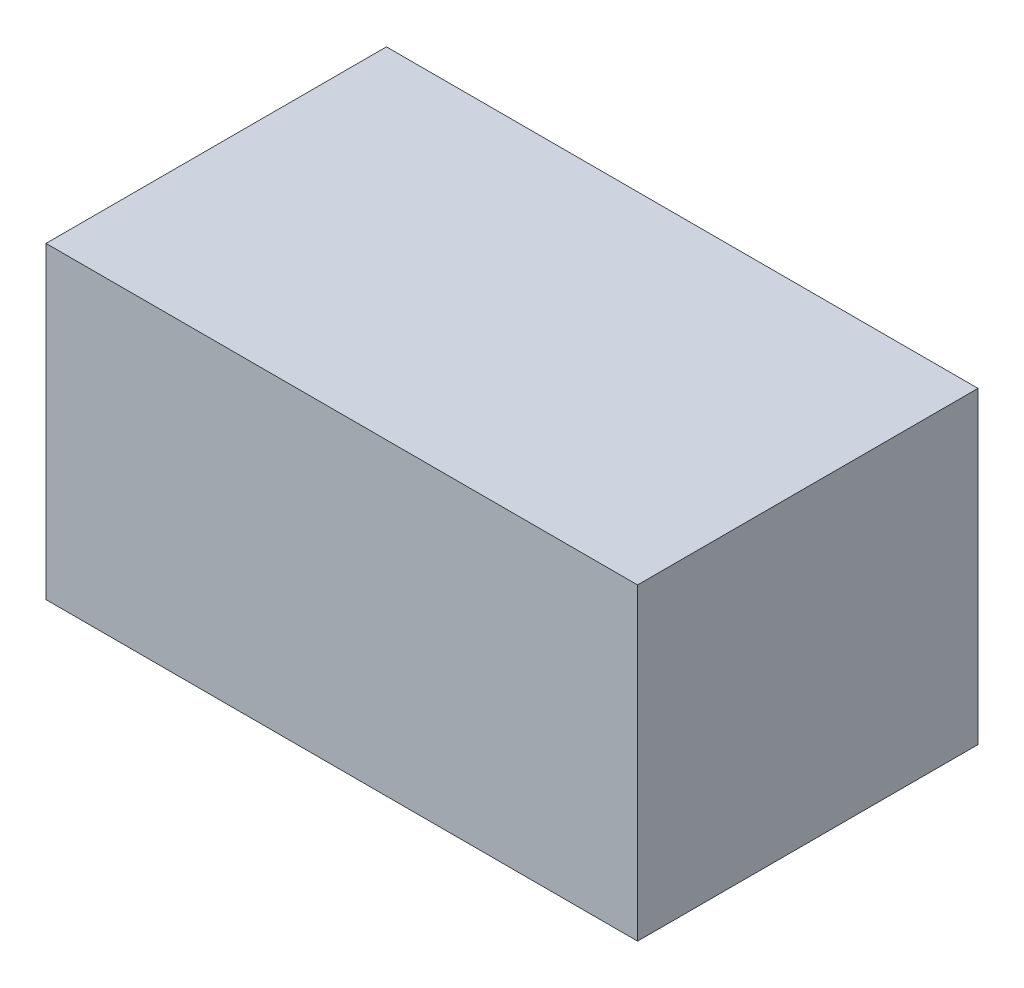
ISO-10303-21;
HEADER;
FILE_DESCRIPTION(('STEP AP214'),'2;1');
FILE_NAME('part.step','',(''),(''),'','','');
FILE_SCHEMA(('AUTOMOTIVE_DESIGN { 1 0 10303 214 1 1 1 1 }'));
ENDSEC;
DATA;
#1=APPLICATION_CONTEXT('core data for automotive mechanical design processes');
#2=APPLICATION_PROTOCOL_DEFINITION('international standard','automotive_design',2000,#1);
#3=PRODUCT_CONTEXT('',#1,'mechanical');
#4=PRODUCT('Part','Part','',(#3));
#5=PRODUCT_RELATED_PRODUCT_CATEGORY('part','',(#4));
#6=PRODUCT_DEFINITION_FORMATION('','',#4);
#7=PRODUCT_DEFINITION_CONTEXT('part definition',#1,'design');
#8=PRODUCT_DEFINITION('design','',#6,#7);
#9=PRODUCT_DEFINITION_SHAPE('','',#8);
#10=(LENGTH_UNIT() NAMED_UNIT(*) SI_UNIT(.MILLI.,.METRE.));
#11=(NAMED_UNIT(*) PLANE_ANGLE_UNIT() SI_UNIT($,.RADIAN.));
#12=(NAMED_UNIT(*) SI_UNIT($,.STERADIAN.) SOLID_ANGLE_UNIT());
#13=UNCERTAINTY_MEASURE_WITH_UNIT(LENGTH_MEASURE(1.E-05),#10,'distance_accuracy_value','');
#14=(GEOMETRIC_REPRESENTATION_CONTEXT(3) GLOBAL_UNCERTAINTY_ASSIGNED_CONTEXT((#13)) GLOBAL_UNIT_ASSIGNED_CONTEXT((#10,
#11,#12)) REPRESENTATION_CONTEXT('',''));
#15=CARTESIAN_POINT('',(0.,0.,0.));
#16=DIRECTION('',(0.,0.,1.));
#17=DIRECTION('',(1.,0.,0.));
#18=AXIS2_PLACEMENT_3D('',#15,#16,#17);
#19=CARTESIAN_POINT('',(-7.72074786236967,8.69243886750483,17.));
#20=DIRECTION('',(1.,0.,0.));
#21=DIRECTION('',(0.,0.,-1.));
#22=AXIS2_PLACEMENT_3D('',#19,#20,#21);
#23=PLANE('',#22);
#24=DIRECTION('',(0.,-1.,0.));
#25=VECTOR('',#24,1.);
#26=CARTESIAN_POINT('',(-7.72074786236967,8.69243886750483,0.));
#27=LINE('',#26,#25);
#28=CARTESIAN_POINT('',(-7.72074786236967,8.69243886750483,0.));
#29=VERTEX_POINT('',#28);
#30=CARTESIAN_POINT('',(-7.72074786236967,-6.71328558530294,0.));
#31=VERTEX_POINT('',#30);
#32=EDGE_CURVE('E282',#29,#31,#27,.T.);
#33=ORIENTED_EDGE('',*,*,#32,.T.);
#34=DIRECTION('',(0.,0.,-1.));
#35=VECTOR('',#34,1.);
#36=CARTESIAN_POINT('',(-7.72074786236967,-6.71328558530294,17.));
#37=LINE('',#36,#35);
#38=CARTESIAN_POINT('',(-7.72074786236967,-6.71328558530294,17.));
#39=VERTEX_POINT('',#38);
#40=EDGE_CURVE('E320',#39,#31,#37,.T.);
#41=ORIENTED_EDGE('',*,*,#40,.F.);
#42=DIRECTION('',(0.,-1.,0.));
#43=VECTOR('',#42,1.);
#44=CARTESIAN_POINT('',(-7.72074786236967,8.69243886750483,17.));
#45=LINE('',#44,#43);
#46=CARTESIAN_POINT('',(-7.72074786236967,8.69243886750483,17.));
#47=VERTEX_POINT('',#46);
#48=EDGE_CURVE('E283',#47,#39,#45,.T.);
#49=ORIENTED_EDGE('',*,*,#48,.F.);
#50=DIRECTION('',(0.,0.,-1.));
#51=VECTOR('',#50,1.);
#52=CARTESIAN_POINT('',(-7.72074786236967,8.69243886750483,17.));
#53=LINE('',#52,#51);
#54=EDGE_CURVE('E297',#47,#29,#53,.T.);
#55=ORIENTED_EDGE('',*,*,#54,.T.);
#56=EDGE_LOOP('',(#33,#41,#49,#55));
#57=FACE_BOUND('',#56,.T.);
#58=ADVANCED_FACE('F51',(#57),#23,.F.);
#59=CARTESIAN_POINT('',(-7.72074786236967,-6.71328558530294,17.));
#60=DIRECTION('',(0.,1.,0.));
#61=DIRECTION('',(0.,0.,1.));
#62=AXIS2_PLACEMENT_3D('',#59,#60,#61);
#63=PLANE('',#62);
#64=DIRECTION('',(1.,0.,0.));
#65=VECTOR('',#64,1.);
#66=CARTESIAN_POINT('',(-7.72074786236967,-6.71328558530294,0.));
#67=LINE('',#66,#65);
#68=CARTESIAN_POINT('',(21.8190512575608,-6.71328558530294,0.));
#69=VERTEX_POINT('',#68);
#70=EDGE_CURVE('E301',#31,#69,#67,.T.);
#71=ORIENTED_EDGE('',*,*,#70,.T.);
#72=DIRECTION('',(0.,0.,-1.));
#73=VECTOR('',#72,1.);
#74=CARTESIAN_POINT('',(21.8190512575608,-6.71328558530294,17.));
#75=LINE('',#74,#73);
#76=CARTESIAN_POINT('',(21.8190512575608,-6.71328558530294,17.));
#77=VERTEX_POINT('',#76);
#78=EDGE_CURVE('E316',#77,#69,#75,.T.);
#79=ORIENTED_EDGE('',*,*,#78,.F.);
#80=DIRECTION('',(1.,0.,0.));
#81=VECTOR('',#80,1.);
#82=CARTESIAN_POINT('',(-7.72074786236967,-6.71328558530294,17.));
#83=LINE('',#82,#81);
#84=EDGE_CURVE('E287',#39,#77,#83,.T.);
#85=ORIENTED_EDGE('',*,*,#84,.F.);
#86=ORIENTED_EDGE('',*,*,#40,.T.);
#87=EDGE_LOOP('',(#71,#79,#85,#86));
#88=FACE_BOUND('',#87,.T.);
#89=ADVANCED_FACE('F390',(#88),#63,.F.);
#90=CARTESIAN_POINT('',(21.8190512575608,8.69243886750483,17.));
#91=DIRECTION('',(-1.,0.,0.));
#92=DIRECTION('',(0.,0.,1.));
#93=AXIS2_PLACEMENT_3D('',#90,#91,#92);
#94=PLANE('',#93);
#95=DIRECTION('',(0.,1.,0.));
#96=VECTOR('',#95,1.);
#97=CARTESIAN_POINT('',(21.8190512575608,8.69243886750483,0.));
#98=LINE('',#97,#96);
#99=CARTESIAN_POINT('',(21.8190512575608,8.69243886750483,0.));
#100=VERTEX_POINT('',#99);
#101=EDGE_CURVE('E304',#69,#100,#98,.T.);
#102=ORIENTED_EDGE('',*,*,#101,.T.);
#103=DIRECTION('',(0.,0.,-1.));
#104=VECTOR('',#103,1.);
#105=CARTESIAN_POINT('',(21.8190512575608,8.69243886750483,17.));
#106=LINE('',#105,#104);
#107=CARTESIAN_POINT('',(21.8190512575608,8.69243886750483,17.));
#108=VERTEX_POINT('',#107);
#109=EDGE_CURVE('E312',#108,#100,#106,.T.);
#110=ORIENTED_EDGE('',*,*,#109,.F.);
#111=DIRECTION('',(0.,1.,0.));
#112=VECTOR('',#111,1.);
#113=CARTESIAN_POINT('',(21.8190512575608,8.69243886750483,17.));
#114=LINE('',#113,#112);
#115=EDGE_CURVE('E291',#77,#108,#114,.T.);
#116=ORIENTED_EDGE('',*,*,#115,.F.);
#117=ORIENTED_EDGE('',*,*,#78,.T.);
#118=EDGE_LOOP('',(#102,#110,#116,#117));
#119=FACE_BOUND('',#118,.T.);
#120=ADVANCED_FACE('F395',(#119),#94,.F.);
#121=CARTESIAN_POINT('',(-7.72074786236967,8.69243886750483,17.));
#122=DIRECTION('',(0.,-1.,0.));
#123=DIRECTION('',(0.,0.,-1.));
#124=AXIS2_PLACEMENT_3D('',#121,#122,#123);
#125=PLANE('',#124);
#126=DIRECTION('',(-1.,0.,0.));
#127=VECTOR('',#126,1.);
#128=CARTESIAN_POINT('',(-7.72074786236967,8.69243886750483,0.));
#129=LINE('',#128,#127);
#130=EDGE_CURVE('E288',#100,#29,#129,.T.);
#131=ORIENTED_EDGE('',*,*,#130,.T.);
#132=ORIENTED_EDGE('',*,*,#54,.F.);
#133=DIRECTION('',(-1.,0.,0.));
#134=VECTOR('',#133,1.);
#135=CARTESIAN_POINT('',(-7.72074786236967,8.69243886750483,17.));
#136=LINE('',#135,#134);
#137=EDGE_CURVE('E294',#108,#47,#136,.T.);
#138=ORIENTED_EDGE('',*,*,#137,.F.);
#139=ORIENTED_EDGE('',*,*,#109,.T.);
#140=EDGE_LOOP('',(#131,#132,#138,#139));
#141=FACE_BOUND('',#140,.T.);
#142=ADVANCED_FACE('F410',(#141),#125,.F.);
#143=CARTESIAN_POINT('',(0.,0.,17.));
#144=DIRECTION('',(0.,0.,1.));
#145=DIRECTION('',(1.,0.,0.));
#146=AXIS2_PLACEMENT_3D('',#143,#144,#145);
#147=PLANE('',#146);
#148=ORIENTED_EDGE('',*,*,#48,.T.);
#149=ORIENTED_EDGE('',*,*,#84,.T.);
#150=ORIENTED_EDGE('',*,*,#115,.T.);
#151=ORIENTED_EDGE('',*,*,#137,.T.);
#152=EDGE_LOOP('',(#148,#149,#150,#151));
#153=FACE_BOUND('',#152,.T.);
#154=ADVANCED_FACE('F406',(#153),#147,.T.);
#155=CARTESIAN_POINT('',(0.,0.,0.));
#156=DIRECTION('',(0.,0.,1.));
#157=DIRECTION('',(1.,0.,0.));
#158=AXIS2_PLACEMENT_3D('',#155,#156,#157);
#159=PLANE('',#158);
#160=DIRECTION('',(-1.,0.,0.));
#161=VECTOR('',#160,1.);
#162=CARTESIAN_POINT('',(20.3190512575608,-1.1528581139363,0.));
#163=LINE('',#162,#161);
#164=CARTESIAN_POINT('',(20.3190512575608,-1.1528581139363,0.));
#165=VERTEX_POINT('',#164);
#166=CARTESIAN_POINT('',(19.3190512575608,-1.1528581139363,0.));
#167=VERTEX_POINT('',#166);
#168=EDGE_CURVE('E206',#165,#167,#163,.T.);
#169=ORIENTED_EDGE('',*,*,#168,.F.);
#170=DIRECTION('',(0.,-1.,0.));
#171=VECTOR('',#170,1.);
#172=CARTESIAN_POINT('',(20.3190512575608,2.3471418860637,0.));
#173=LINE('',#172,#171);
#174=CARTESIAN_POINT('',(20.3190512575608,2.3471418860637,0.));
#175=VERTEX_POINT('',#174);
#176=EDGE_CURVE('E66',#175,#165,#173,.T.);
#177=ORIENTED_EDGE('',*,*,#176,.F.);
#178=DIRECTION('',(1.,0.,0.));
#179=VECTOR('',#178,1.);
#180=CARTESIAN_POINT('',(20.3190512575608,2.3471418860637,0.));
#181=LINE('',#180,#179);
#182=CARTESIAN_POINT('',(19.3190512575608,2.3471418860637,0.));
#183=VERTEX_POINT('',#182);
#184=EDGE_CURVE('E193',#183,#175,#181,.T.);
#185=ORIENTED_EDGE('',*,*,#184,.F.);
#186=DIRECTION('',(0.,1.,0.));
#187=VECTOR('',#186,1.);
#188=CARTESIAN_POINT('',(19.3190512575608,2.3471418860637,0.));
#189=LINE('',#188,#187);
#190=EDGE_CURVE('E197',#167,#183,#189,.T.);
#191=ORIENTED_EDGE('',*,*,#190,.F.);
#192=EDGE_LOOP('',(#169,#177,#185,#191));
#193=FACE_BOUND('',#192,.T.);
#194=DIRECTION('',(-1.,0.,0.));
#195=VECTOR('',#194,1.);
#196=CARTESIAN_POINT('',(-5.22074786236966,-1.1528581139363,0.));
#197=LINE('',#196,#195);
#198=CARTESIAN_POINT('',(-5.22074786236966,-1.1528581139363,0.));
#199=VERTEX_POINT('',#198);
#200=CARTESIAN_POINT('',(-6.22074786236967,-1.1528581139363,0.));
#201=VERTEX_POINT('',#200);
#202=EDGE_CURVE('E243',#199,#201,#197,.T.);
#203=ORIENTED_EDGE('',*,*,#202,.F.);
#204=DIRECTION('',(0.,-1.,0.));
#205=VECTOR('',#204,1.);
#206=CARTESIAN_POINT('',(-5.22074786236966,2.3471418860637,0.));
#207=LINE('',#206,#205);
#208=CARTESIAN_POINT('',(-5.22074786236966,2.3471418860637,0.));
#209=VERTEX_POINT('',#208);
#210=EDGE_CURVE('E74',#209,#199,#207,.T.);
#211=ORIENTED_EDGE('',*,*,#210,.F.);
#212=DIRECTION('',(1.,0.,0.));
#213=VECTOR('',#212,1.);
#214=CARTESIAN_POINT('',(-5.22074786236966,2.3471418860637,0.));
#215=LINE('',#214,#213);
#216=CARTESIAN_POINT('',(-6.22074786236967,2.3471418860637,0.));
#217=VERTEX_POINT('',#216);
#218=EDGE_CURVE('E234',#217,#209,#215,.T.);
#219=ORIENTED_EDGE('',*,*,#218,.F.);
#220=DIRECTION('',(0.,1.,0.));
#221=VECTOR('',#220,1.);
#222=CARTESIAN_POINT('',(-6.22074786236967,2.3471418860637,0.));
#223=LINE('',#222,#221);
#224=EDGE_CURVE('E238',#201,#217,#223,.T.);
#225=ORIENTED_EDGE('',*,*,#224,.F.);
#226=EDGE_LOOP('',(#203,#211,#219,#225));
#227=FACE_BOUND('',#226,.T.);
#228=DIRECTION('',(0.,-1.,0.));
#229=VECTOR('',#228,1.);
#230=CARTESIAN_POINT('',(20.4425185421705,8.,0.));
#231=LINE('',#230,#229);
#232=CARTESIAN_POINT('',(20.4425185421705,8.,0.));
#233=VERTEX_POINT('',#232);
#234=CARTESIAN_POINT('',(20.4425185421705,6.,0.));
#235=VERTEX_POINT('',#234);
#236=EDGE_CURVE('E351',#233,#235,#231,.T.);
#237=ORIENTED_EDGE('',*,*,#236,.F.);
#238=DIRECTION('',(-1.,0.,0.));
#239=VECTOR('',#238,1.);
#240=CARTESIAN_POINT('',(0.,8.,0.));
#241=LINE('',#240,#239);
#242=CARTESIAN_POINT('',(-6.38590858257565,8.,0.));
#243=VERTEX_POINT('',#242);
#244=EDGE_CURVE('E11',#233,#243,#241,.T.);
#245=ORIENTED_EDGE('',*,*,#244,.T.);
#246=DIRECTION('',(0.,-1.,0.));
#247=VECTOR('',#246,1.);
#248=CARTESIAN_POINT('',(-6.38590858257565,8.,0.));
#249=LINE('',#248,#247);
#250=CARTESIAN_POINT('',(-6.38590858257565,6.,0.));
#251=VERTEX_POINT('',#250);
#252=EDGE_CURVE('E59',#251,#243,#249,.F.);
#253=ORIENTED_EDGE('',*,*,#252,.F.);
#254=DIRECTION('',(0.707106781186551,-0.707106781186544,0.));
#255=VECTOR('',#254,1.);
#256=CARTESIAN_POINT('',(7.02830497979745,-7.41421356237296,0.));
#257=LINE('',#256,#255);
#258=CARTESIAN_POINT('',(-0.385908582575589,0.,0.));
#259=VERTEX_POINT('',#258);
#260=EDGE_CURVE('E343',#251,#259,#257,.T.);
#261=ORIENTED_EDGE('',*,*,#260,.T.);
#262=DIRECTION('',(-0.819152044288995,-0.573576436351042,0.));
#263=VECTOR('',#262,1.);
#264=CARTESIAN_POINT('',(7.02830497979745,5.19148822627021,0.));
#265=LINE('',#264,#263);
#266=CARTESIAN_POINT('',(-6.09850060954411,-4.,0.));
#267=VERTEX_POINT('',#266);
#268=EDGE_CURVE('E339',#259,#267,#265,.T.);
#269=ORIENTED_EDGE('',*,*,#268,.T.);
#270=DIRECTION('',(0.,1.,0.));
#271=VECTOR('',#270,1.);
#272=CARTESIAN_POINT('',(-6.09850060954411,-6.,0.));
#273=LINE('',#272,#271);
#274=CARTESIAN_POINT('',(-6.09850060954411,-6.,0.));
#275=VERTEX_POINT('',#274);
#276=EDGE_CURVE('E328',#275,#267,#273,.T.);
#277=ORIENTED_EDGE('',*,*,#276,.F.);
#278=DIRECTION('',(1.,0.,0.));
#279=VECTOR('',#278,1.);
#280=CARTESIAN_POINT('',(0.,-6.,0.));
#281=LINE('',#280,#279);
#282=CARTESIAN_POINT('',(20.155110569139,-6.,0.));
#283=VERTEX_POINT('',#282);
#284=EDGE_CURVE('E324',#275,#283,#281,.T.);
#285=ORIENTED_EDGE('',*,*,#284,.T.);
#286=DIRECTION('',(0.,1.,0.));
#287=VECTOR('',#286,1.);
#288=CARTESIAN_POINT('',(20.155110569139,-6.,0.));
#289=LINE('',#288,#287);
#290=CARTESIAN_POINT('',(20.155110569139,-4.,0.));
#291=VERTEX_POINT('',#290);
#292=EDGE_CURVE('E331',#291,#283,#289,.F.);
#293=ORIENTED_EDGE('',*,*,#292,.F.);
#294=DIRECTION('',(-0.819152044288995,0.573576436351042,0.));
#295=VECTOR('',#294,1.);
#296=CARTESIAN_POINT('',(7.02830497979745,5.19148822627021,0.));
#297=LINE('',#296,#295);
#298=CARTESIAN_POINT('',(14.4425185421705,0.,0.));
#299=VERTEX_POINT('',#298);
#300=EDGE_CURVE('E335',#291,#299,#297,.T.);
#301=ORIENTED_EDGE('',*,*,#300,.T.);
#302=DIRECTION('',(0.707106781186551,0.707106781186544,0.));
#303=VECTOR('',#302,1.);
#304=CARTESIAN_POINT('',(7.02830497979745,-7.41421356237296,0.));
#305=LINE('',#304,#303);
#306=EDGE_CURVE('E347',#299,#235,#305,.T.);
#307=ORIENTED_EDGE('',*,*,#306,.T.);
#308=EDGE_LOOP('',(#237,#245,#253,#261,#269,#277,#285,#293,#301,#307));
#309=FACE_BOUND('',#308,.T.);
#310=ORIENTED_EDGE('',*,*,#32,.F.);
#311=ORIENTED_EDGE('',*,*,#130,.F.);
#312=ORIENTED_EDGE('',*,*,#101,.F.);
#313=ORIENTED_EDGE('',*,*,#70,.F.);
#314=EDGE_LOOP('',(#310,#311,#312,#313));
#315=FACE_BOUND('',#314,.T.);
#316=ADVANCED_FACE('F363',(#193,#227,#309,#315),#159,.F.);
#317=CARTESIAN_POINT('',(7.02830497979745,0.,0.));
#318=DIRECTION('',(0.,-1.,0.));
#319=DIRECTION('',(1.,0.,0.));
#320=AXIS2_PLACEMENT_3D('',#317,#318,#319);
#321=CONICAL_SURFACE('',#320,7.41421356237304,0.959931088596887);
#322=CARTESIAN_POINT('',(7.02830497979745,0.,0.));
#323=DIRECTION('',(0.,1.,0.));
#324=DIRECTION('',(-1.,0.,0.));
#325=AXIS2_PLACEMENT_3D('',#322,#323,#324);
#326=CIRCLE('',#325,7.41421356237304);
#327=EDGE_CURVE('E278',#259,#299,#326,.T.);
#328=ORIENTED_EDGE('',*,*,#327,.T.);
#329=ORIENTED_EDGE('',*,*,#300,.F.);
#330=CARTESIAN_POINT('',(7.02830497979745,-4.,0.));
#331=DIRECTION('',(0.,-1.,0.));
#332=DIRECTION('',(1.,0.,0.));
#333=AXIS2_PLACEMENT_3D('',#330,#331,#332);
#334=CIRCLE('',#333,13.1268055893416);
#335=EDGE_CURVE('E215',#291,#267,#334,.T.);
#336=ORIENTED_EDGE('',*,*,#335,.T.);
#337=ORIENTED_EDGE('',*,*,#268,.F.);
#338=EDGE_LOOP('',(#328,#329,#336,#337));
#339=FACE_BOUND('',#338,.T.);
#340=ADVANCED_FACE('F370',(#339),#321,.F.);
#341=CARTESIAN_POINT('',(7.02830497979745,6.,0.));
#342=DIRECTION('',(0.,1.,0.));
#343=DIRECTION('',(-1.,0.,0.));
#344=AXIS2_PLACEMENT_3D('',#341,#342,#343);
#345=CONICAL_SURFACE('',#344,13.4142135623731,0.785398163397453);
#346=ORIENTED_EDGE('',*,*,#327,.F.);
#347=ORIENTED_EDGE('',*,*,#260,.F.);
#348=CARTESIAN_POINT('',(7.02830497979745,6.,0.));
#349=DIRECTION('',(0.,1.,0.));
#350=DIRECTION('',(-1.,0.,0.));
#351=AXIS2_PLACEMENT_3D('',#348,#349,#350);
#352=CIRCLE('',#351,13.4142135623731);
#353=EDGE_CURVE('E274',#251,#235,#352,.T.);
#354=ORIENTED_EDGE('',*,*,#353,.T.);
#355=ORIENTED_EDGE('',*,*,#306,.F.);
#356=EDGE_LOOP('',(#346,#347,#354,#355));
#357=FACE_BOUND('',#356,.T.);
#358=ADVANCED_FACE('F367',(#357),#345,.F.);
#359=CARTESIAN_POINT('',(7.02830497979745,8.,0.));
#360=DIRECTION('',(0.,-1.,0.));
#361=DIRECTION('',(1.,0.,0.));
#362=AXIS2_PLACEMENT_3D('',#359,#360,#361);
#363=CYLINDRICAL_SURFACE('',#362,13.4142135623731);
#364=ORIENTED_EDGE('',*,*,#252,.T.);
#365=CARTESIAN_POINT('',(7.02830497979745,8.,0.));
#366=DIRECTION('',(0.,1.,0.));
#367=DIRECTION('',(-1.,0.,0.));
#368=AXIS2_PLACEMENT_3D('',#365,#366,#367);
#369=CIRCLE('',#368,13.4142135623731);
#370=EDGE_CURVE('E267',#243,#233,#369,.T.);
#371=ORIENTED_EDGE('',*,*,#370,.T.);
#372=ORIENTED_EDGE('',*,*,#236,.T.);
#373=ORIENTED_EDGE('',*,*,#353,.F.);
#374=EDGE_LOOP('',(#364,#371,#372,#373));
#375=FACE_BOUND('',#374,.T.);
#376=ADVANCED_FACE('F358',(#375),#363,.F.);
#377=CARTESIAN_POINT('',(7.02830497979745,8.,0.));
#378=DIRECTION('',(0.,1.,0.));
#379=DIRECTION('',(-1.,0.,0.));
#380=AXIS2_PLACEMENT_3D('',#377,#378,#379);
#381=PLANE('',#380);
#382=ORIENTED_EDGE('',*,*,#370,.F.);
#383=ORIENTED_EDGE('',*,*,#244,.F.);
#384=EDGE_LOOP('',(#382,#383));
#385=FACE_BOUND('',#384,.T.);
#386=ADVANCED_FACE('F362',(#385),#381,.F.);
#387=CARTESIAN_POINT('',(7.02830497979745,-6.,0.));
#388=DIRECTION('',(0.,1.,0.));
#389=DIRECTION('',(-1.,0.,0.));
#390=AXIS2_PLACEMENT_3D('',#387,#388,#389);
#391=CYLINDRICAL_SURFACE('',#390,13.1268055893416);
#392=ORIENTED_EDGE('',*,*,#292,.T.);
#393=CARTESIAN_POINT('',(7.02830497979745,-6.,0.));
#394=DIRECTION('',(0.,-1.,0.));
#395=DIRECTION('',(1.,0.,0.));
#396=AXIS2_PLACEMENT_3D('',#393,#394,#395);
#397=CIRCLE('',#396,13.1268055893416);
#398=EDGE_CURVE('E263',#283,#275,#397,.T.);
#399=ORIENTED_EDGE('',*,*,#398,.T.);
#400=ORIENTED_EDGE('',*,*,#276,.T.);
#401=ORIENTED_EDGE('',*,*,#335,.F.);
#402=EDGE_LOOP('',(#392,#399,#400,#401));
#403=FACE_BOUND('',#402,.T.);
#404=ADVANCED_FACE('F374',(#403),#391,.F.);
#405=CARTESIAN_POINT('',(7.02830497979745,-6.,0.));
#406=DIRECTION('',(0.,-1.,0.));
#407=DIRECTION('',(1.,0.,0.));
#408=AXIS2_PLACEMENT_3D('',#405,#406,#407);
#409=PLANE('',#408);
#410=ORIENTED_EDGE('',*,*,#398,.F.);
#411=ORIENTED_EDGE('',*,*,#284,.F.);
#412=EDGE_LOOP('',(#410,#411));
#413=FACE_BOUND('',#412,.T.);
#414=ADVANCED_FACE('F376',(#413),#409,.F.);
#415=CARTESIAN_POINT('',(-5.22074786236966,2.3471418860637,2.));
#416=DIRECTION('',(1.,0.,0.));
#417=DIRECTION('',(0.,0.,-1.));
#418=AXIS2_PLACEMENT_3D('',#415,#416,#417);
#419=PLANE('',#418);
#420=ORIENTED_EDGE('',*,*,#210,.T.);
#421=DIRECTION('',(0.,0.,-1.));
#422=VECTOR('',#421,1.);
#423=CARTESIAN_POINT('',(-5.22074786236966,-1.1528581139363,2.));
#424=LINE('',#423,#422);
#425=CARTESIAN_POINT('',(-5.22074786236966,-1.1528581139363,2.));
#426=VERTEX_POINT('',#425);
#427=EDGE_CURVE('E221',#426,#199,#424,.T.);
#428=ORIENTED_EDGE('',*,*,#427,.F.);
#429=DIRECTION('',(0.,-1.,0.));
#430=VECTOR('',#429,1.);
#431=CARTESIAN_POINT('',(-5.22074786236966,2.3471418860637,2.));
#432=LINE('',#431,#430);
#433=CARTESIAN_POINT('',(-5.22074786236966,2.3471418860637,2.));
#434=VERTEX_POINT('',#433);
#435=EDGE_CURVE('E239',#434,#426,#432,.T.);
#436=ORIENTED_EDGE('',*,*,#435,.F.);
#437=DIRECTION('',(0.,0.,-1.));
#438=VECTOR('',#437,1.);
#439=CARTESIAN_POINT('',(-5.22074786236966,2.3471418860637,2.));
#440=LINE('',#439,#438);
#441=EDGE_CURVE('E231',#434,#209,#440,.T.);
#442=ORIENTED_EDGE('',*,*,#441,.T.);
#443=EDGE_LOOP('',(#420,#428,#436,#442));
#444=FACE_BOUND('',#443,.T.);
#445=ADVANCED_FACE('F378',(#444),#419,.F.);
#446=CARTESIAN_POINT('',(-5.22074786236966,2.3471418860637,2.));
#447=DIRECTION('',(0.,1.,0.));
#448=DIRECTION('',(-1.,0.,0.));
#449=AXIS2_PLACEMENT_3D('',#446,#447,#448);
#450=PLANE('',#449);
#451=ORIENTED_EDGE('',*,*,#218,.T.);
#452=ORIENTED_EDGE('',*,*,#441,.F.);
#453=DIRECTION('',(1.,0.,0.));
#454=VECTOR('',#453,1.);
#455=CARTESIAN_POINT('',(-5.22074786236966,2.3471418860637,2.));
#456=LINE('',#455,#454);
#457=CARTESIAN_POINT('',(-6.22074786236967,2.3471418860637,2.));
#458=VERTEX_POINT('',#457);
#459=EDGE_CURVE('E224',#458,#434,#456,.T.);
#460=ORIENTED_EDGE('',*,*,#459,.F.);
#461=DIRECTION('',(0.,0.,-1.));
#462=VECTOR('',#461,1.);
#463=CARTESIAN_POINT('',(-6.22074786236967,2.3471418860637,2.));
#464=LINE('',#463,#462);
#465=EDGE_CURVE('E228',#458,#217,#464,.T.);
#466=ORIENTED_EDGE('',*,*,#465,.T.);
#467=EDGE_LOOP('',(#451,#452,#460,#466));
#468=FACE_BOUND('',#467,.T.);
#469=ADVANCED_FACE('F385',(#468),#450,.F.);
#470=CARTESIAN_POINT('',(-6.22074786236967,2.3471418860637,2.));
#471=DIRECTION('',(-1.,0.,0.));
#472=DIRECTION('',(0.,-1.,0.));
#473=AXIS2_PLACEMENT_3D('',#470,#471,#472);
#474=PLANE('',#473);
#475=ORIENTED_EDGE('',*,*,#224,.T.);
#476=ORIENTED_EDGE('',*,*,#465,.F.);
#477=DIRECTION('',(0.,1.,0.));
#478=VECTOR('',#477,1.);
#479=CARTESIAN_POINT('',(-6.22074786236967,2.3471418860637,2.));
#480=LINE('',#479,#478);
#481=CARTESIAN_POINT('',(-6.22074786236967,-1.1528581139363,2.));
#482=VERTEX_POINT('',#481);
#483=EDGE_CURVE('E252',#482,#458,#480,.T.);
#484=ORIENTED_EDGE('',*,*,#483,.F.);
#485=DIRECTION('',(0.,0.,-1.));
#486=VECTOR('',#485,1.);
#487=CARTESIAN_POINT('',(-6.22074786236967,-1.1528581139363,2.));
#488=LINE('',#487,#486);
#489=EDGE_CURVE('E225',#482,#201,#488,.T.);
#490=ORIENTED_EDGE('',*,*,#489,.T.);
#491=EDGE_LOOP('',(#475,#476,#484,#490));
#492=FACE_BOUND('',#491,.T.);
#493=ADVANCED_FACE('F460',(#492),#474,.F.);
#494=CARTESIAN_POINT('',(-5.22074786236966,-1.1528581139363,2.));
#495=DIRECTION('',(0.,-1.,0.));
#496=DIRECTION('',(0.,0.,-1.));
#497=AXIS2_PLACEMENT_3D('',#494,#495,#496);
#498=PLANE('',#497);
#499=ORIENTED_EDGE('',*,*,#202,.T.);
#500=ORIENTED_EDGE('',*,*,#489,.F.);
#501=DIRECTION('',(-1.,0.,0.));
#502=VECTOR('',#501,1.);
#503=CARTESIAN_POINT('',(-5.22074786236966,-1.1528581139363,2.));
#504=LINE('',#503,#502);
#505=EDGE_CURVE('E256',#426,#482,#504,.T.);
#506=ORIENTED_EDGE('',*,*,#505,.F.);
#507=ORIENTED_EDGE('',*,*,#427,.T.);
#508=EDGE_LOOP('',(#499,#500,#506,#507));
#509=FACE_BOUND('',#508,.T.);
#510=ADVANCED_FACE('F470',(#509),#498,.F.);
#511=CARTESIAN_POINT('',(0.,0.,2.));
#512=DIRECTION('',(0.,0.,-1.));
#513=DIRECTION('',(-1.,0.,0.));
#514=AXIS2_PLACEMENT_3D('',#511,#512,#513);
#515=PLANE('',#514);
#516=ORIENTED_EDGE('',*,*,#435,.T.);
#517=ORIENTED_EDGE('',*,*,#505,.T.);
#518=ORIENTED_EDGE('',*,*,#483,.T.);
#519=ORIENTED_EDGE('',*,*,#459,.T.);
#520=EDGE_LOOP('',(#516,#517,#518,#519));
#521=FACE_BOUND('',#520,.T.);
#522=ADVANCED_FACE('F480',(#521),#515,.T.);
#523=CARTESIAN_POINT('',(20.3190512575608,2.3471418860637,2.));
#524=DIRECTION('',(1.,0.,0.));
#525=DIRECTION('',(0.,0.,-1.));
#526=AXIS2_PLACEMENT_3D('',#523,#524,#525);
#527=PLANE('',#526);
#528=ORIENTED_EDGE('',*,*,#176,.T.);
#529=DIRECTION('',(0.,0.,-1.));
#530=VECTOR('',#529,1.);
#531=CARTESIAN_POINT('',(20.3190512575608,-1.1528581139363,2.));
#532=LINE('',#531,#530);
#533=CARTESIAN_POINT('',(20.3190512575608,-1.1528581139363,2.));
#534=VERTEX_POINT('',#533);
#535=EDGE_CURVE('E168',#534,#165,#532,.T.);
#536=ORIENTED_EDGE('',*,*,#535,.F.);
#537=DIRECTION('',(0.,-1.,0.));
#538=VECTOR('',#537,1.);
#539=CARTESIAN_POINT('',(20.3190512575608,2.3471418860637,2.));
#540=LINE('',#539,#538);
#541=CARTESIAN_POINT('',(20.3190512575608,2.3471418860637,2.));
#542=VERTEX_POINT('',#541);
#543=EDGE_CURVE('E172',#542,#534,#540,.T.);
#544=ORIENTED_EDGE('',*,*,#543,.F.);
#545=DIRECTION('',(0.,0.,-1.));
#546=VECTOR('',#545,1.);
#547=CARTESIAN_POINT('',(20.3190512575608,2.3471418860637,2.));
#548=LINE('',#547,#546);
#549=EDGE_CURVE('E212',#542,#175,#548,.T.);
#550=ORIENTED_EDGE('',*,*,#549,.T.);
#551=EDGE_LOOP('',(#528,#536,#544,#550));
#552=FACE_BOUND('',#551,.T.);
#553=ADVANCED_FACE('F170',(#552),#527,.F.);
#554=CARTESIAN_POINT('',(20.3190512575608,2.3471418860637,2.));
#555=DIRECTION('',(0.,1.,0.));
#556=DIRECTION('',(0.,0.,1.));
#557=AXIS2_PLACEMENT_3D('',#554,#555,#556);
#558=PLANE('',#557);
#559=ORIENTED_EDGE('',*,*,#184,.T.);
#560=ORIENTED_EDGE('',*,*,#549,.F.);
#561=DIRECTION('',(1.,0.,0.));
#562=VECTOR('',#561,1.);
#563=CARTESIAN_POINT('',(20.3190512575608,2.3471418860637,2.));
#564=LINE('',#563,#562);
#565=CARTESIAN_POINT('',(19.3190512575608,2.3471418860637,2.));
#566=VERTEX_POINT('',#565);
#567=EDGE_CURVE('E179',#566,#542,#564,.T.);
#568=ORIENTED_EDGE('',*,*,#567,.F.);
#569=DIRECTION('',(0.,0.,-1.));
#570=VECTOR('',#569,1.);
#571=CARTESIAN_POINT('',(19.3190512575608,2.3471418860637,2.));
#572=LINE('',#571,#570);
#573=EDGE_CURVE('E216',#566,#183,#572,.T.);
#574=ORIENTED_EDGE('',*,*,#573,.T.);
#575=EDGE_LOOP('',(#559,#560,#568,#574));
#576=FACE_BOUND('',#575,.T.);
#577=ADVANCED_FACE('F498',(#576),#558,.F.);
#578=CARTESIAN_POINT('',(19.3190512575608,2.3471418860637,2.));
#579=DIRECTION('',(-1.,0.,0.));
#580=DIRECTION('',(0.,0.,1.));
#581=AXIS2_PLACEMENT_3D('',#578,#579,#580);
#582=PLANE('',#581);
#583=ORIENTED_EDGE('',*,*,#190,.T.);
#584=ORIENTED_EDGE('',*,*,#573,.F.);
#585=DIRECTION('',(0.,1.,0.));
#586=VECTOR('',#585,1.);
#587=CARTESIAN_POINT('',(19.3190512575608,2.3471418860637,2.));
#588=LINE('',#587,#586);
#589=CARTESIAN_POINT('',(19.3190512575608,-1.1528581139363,2.));
#590=VERTEX_POINT('',#589);
#591=EDGE_CURVE('E188',#590,#566,#588,.T.);
#592=ORIENTED_EDGE('',*,*,#591,.F.);
#593=DIRECTION('',(0.,0.,-1.));
#594=VECTOR('',#593,1.);
#595=CARTESIAN_POINT('',(19.3190512575608,-1.1528581139363,2.));
#596=LINE('',#595,#594);
#597=EDGE_CURVE('E178',#590,#167,#596,.T.);
#598=ORIENTED_EDGE('',*,*,#597,.T.);
#599=EDGE_LOOP('',(#583,#584,#592,#598));
#600=FACE_BOUND('',#599,.T.);
#601=ADVANCED_FACE('F507',(#600),#582,.F.);
#602=CARTESIAN_POINT('',(20.3190512575608,-1.1528581139363,2.));
#603=DIRECTION('',(0.,-1.,0.));
#604=DIRECTION('',(0.,0.,-1.));
#605=AXIS2_PLACEMENT_3D('',#602,#603,#604);
#606=PLANE('',#605);
#607=ORIENTED_EDGE('',*,*,#168,.T.);
#608=ORIENTED_EDGE('',*,*,#597,.F.);
#609=DIRECTION('',(-1.,0.,0.));
#610=VECTOR('',#609,1.);
#611=CARTESIAN_POINT('',(20.3190512575608,-1.1528581139363,2.));
#612=LINE('',#611,#610);
#613=EDGE_CURVE('E182',#534,#590,#612,.T.);
#614=ORIENTED_EDGE('',*,*,#613,.F.);
#615=ORIENTED_EDGE('',*,*,#535,.T.);
#616=EDGE_LOOP('',(#607,#608,#614,#615));
#617=FACE_BOUND('',#616,.T.);
#618=ADVANCED_FACE('F183',(#617),#606,.F.);
#619=CARTESIAN_POINT('',(0.,0.,2.));
#620=DIRECTION('',(0.,0.,-1.));
#621=DIRECTION('',(-1.,0.,0.));
#622=AXIS2_PLACEMENT_3D('',#619,#620,#621);
#623=PLANE('',#622);
#624=ORIENTED_EDGE('',*,*,#543,.T.);
#625=ORIENTED_EDGE('',*,*,#613,.T.);
#626=ORIENTED_EDGE('',*,*,#591,.T.);
#627=ORIENTED_EDGE('',*,*,#567,.T.);
#628=EDGE_LOOP('',(#624,#625,#626,#627));
#629=FACE_BOUND('',#628,.T.);
#630=ADVANCED_FACE('F190',(#629),#623,.T.);
#631=CLOSED_SHELL('',(#58,#89,#120,#142,#154,#316,#340,#358,#376,#386,#404,#414,#445,#469,#493,
#510,#522,#553,#577,#601,#618,#630));
#632=MANIFOLD_SOLID_BREP('B2',#631);
#633=ADVANCED_BREP_SHAPE_REPRESENTATION('',(#18,#632),#14);
#634=SHAPE_DEFINITION_REPRESENTATION(#9,#633);
ENDSEC;
END-ISO-10303-21;
